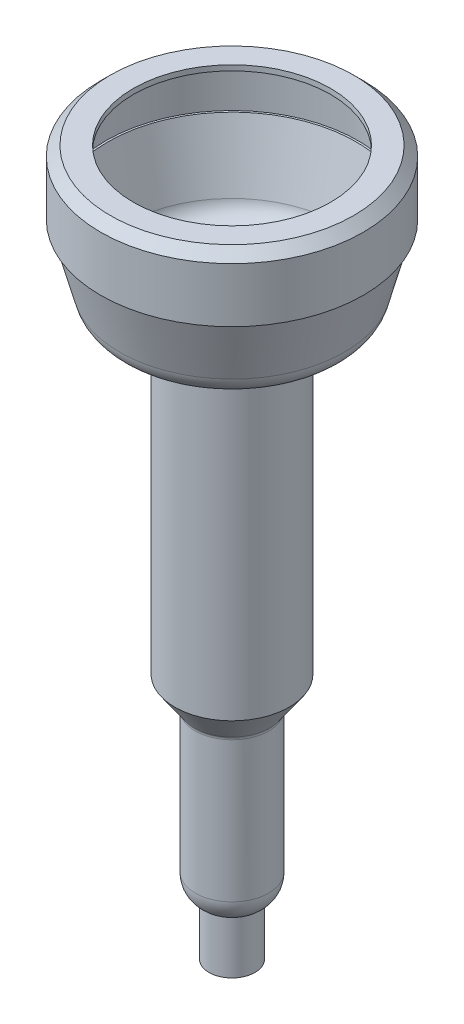
ISO-10303-21;
HEADER;
FILE_DESCRIPTION(('STEP AP214'),'2;1');
FILE_NAME('part.step','',(''),(''),'','','');
FILE_SCHEMA(('AUTOMOTIVE_DESIGN { 1 0 10303 214 1 1 1 1 }'));
ENDSEC;
DATA;
#1=APPLICATION_CONTEXT('core data for automotive mechanical design processes');
#2=APPLICATION_PROTOCOL_DEFINITION('international standard','automotive_design',2000,#1);
#3=PRODUCT_CONTEXT('',#1,'mechanical');
#4=PRODUCT('Part','Part','',(#3));
#5=PRODUCT_RELATED_PRODUCT_CATEGORY('part','',(#4));
#6=PRODUCT_DEFINITION_FORMATION('','',#4);
#7=PRODUCT_DEFINITION_CONTEXT('part definition',#1,'design');
#8=PRODUCT_DEFINITION('design','',#6,#7);
#9=PRODUCT_DEFINITION_SHAPE('','',#8);
#10=(LENGTH_UNIT() NAMED_UNIT(*) SI_UNIT(.MILLI.,.METRE.));
#11=(NAMED_UNIT(*) PLANE_ANGLE_UNIT() SI_UNIT($,.RADIAN.));
#12=(NAMED_UNIT(*) SI_UNIT($,.STERADIAN.) SOLID_ANGLE_UNIT());
#13=UNCERTAINTY_MEASURE_WITH_UNIT(LENGTH_MEASURE(1.E-05),#10,'distance_accuracy_value','');
#14=(GEOMETRIC_REPRESENTATION_CONTEXT(3) GLOBAL_UNCERTAINTY_ASSIGNED_CONTEXT((#13)) GLOBAL_UNIT_ASSIGNED_CONTEXT((#10,
#11,#12)) REPRESENTATION_CONTEXT('',''));
#15=CARTESIAN_POINT('',(0.,0.,0.));
#16=DIRECTION('',(0.,0.,1.));
#17=DIRECTION('',(1.,0.,0.));
#18=AXIS2_PLACEMENT_3D('',#15,#16,#17);
#19=CARTESIAN_POINT('',(0.,14.5,0.));
#20=DIRECTION('',(0.,1.,0.));
#21=DIRECTION('',(-1.,0.,0.));
#22=AXIS2_PLACEMENT_3D('',#19,#20,#21);
#23=CYLINDRICAL_SURFACE('',#22,1.4);
#24=CARTESIAN_POINT('',(0.,-9.21014938269311,0.));
#25=DIRECTION('',(0.,-1.,0.));
#26=DIRECTION('',(1.,0.,0.));
#27=AXIS2_PLACEMENT_3D('',#24,#25,#26);
#28=CIRCLE('',#27,1.4);
#29=CARTESIAN_POINT('',(1.4,-9.21014938269311,0.));
#30=VERTEX_POINT('',#29);
#31=EDGE_CURVE('E11',#30,#30,#28,.F.);
#32=ORIENTED_EDGE('',*,*,#31,.T.);
#33=EDGE_LOOP('',(#32));
#34=FACE_BOUND('',#33,.T.);
#35=CARTESIAN_POINT('',(0.,-3.86569170809116,0.));
#36=DIRECTION('',(0.,1.,0.));
#37=DIRECTION('',(-1.,0.,0.));
#38=AXIS2_PLACEMENT_3D('',#35,#36,#37);
#39=CIRCLE('',#38,1.4);
#40=CARTESIAN_POINT('',(-1.4,-3.86569170809116,0.));
#41=VERTEX_POINT('',#40);
#42=EDGE_CURVE('E82',#41,#41,#39,.T.);
#43=ORIENTED_EDGE('',*,*,#42,.F.);
#44=EDGE_LOOP('',(#43));
#45=FACE_BOUND('',#44,.T.);
#46=ADVANCED_FACE('F38',(#34,#45),#23,.T.);
#47=CARTESIAN_POINT('',(0.,14.5,0.));
#48=DIRECTION('',(0.,1.,0.));
#49=DIRECTION('',(-1.,0.,0.));
#50=AXIS2_PLACEMENT_3D('',#47,#48,#49);
#51=CYLINDRICAL_SURFACE('',#50,3.75577865213881);
#52=CARTESIAN_POINT('',(0.,14.7463628033699,0.));
#53=DIRECTION('',(0.,1.,0.));
#54=DIRECTION('',(-1.,0.,0.));
#55=AXIS2_PLACEMENT_3D('',#52,#53,#54);
#56=CIRCLE('',#55,3.75577865213881);
#57=CARTESIAN_POINT('',(-3.75577865213881,14.7463628033699,0.));
#58=VERTEX_POINT('',#57);
#59=EDGE_CURVE('E49',#58,#58,#56,.T.);
#60=ORIENTED_EDGE('',*,*,#59,.T.);
#61=EDGE_LOOP('',(#60));
#62=FACE_BOUND('',#61,.T.);
#63=CARTESIAN_POINT('',(0.,14.5463628033699,0.));
#64=DIRECTION('',(0.,1.,0.));
#65=DIRECTION('',(-1.,0.,0.));
#66=AXIS2_PLACEMENT_3D('',#63,#64,#65);
#67=CIRCLE('',#66,3.75577865213881);
#68=CARTESIAN_POINT('',(-3.75577865213881,14.5463628033699,0.));
#69=VERTEX_POINT('',#68);
#70=EDGE_CURVE('E109',#69,#69,#67,.T.);
#71=ORIENTED_EDGE('',*,*,#70,.F.);
#72=EDGE_LOOP('',(#71));
#73=FACE_BOUND('',#72,.T.);
#74=ADVANCED_FACE('F134',(#62,#73),#51,.F.);
#75=CARTESIAN_POINT('',(-3.75577865213881,14.7463628033699,0.));
#76=DIRECTION('',(0.,1.,0.));
#77=DIRECTION('',(-1.,0.,0.));
#78=AXIS2_PLACEMENT_3D('',#75,#76,#77);
#79=PLANE('',#78);
#80=CARTESIAN_POINT('',(0.,14.7463628033699,0.));
#81=DIRECTION('',(0.,1.,0.));
#82=DIRECTION('',(-1.,0.,0.));
#83=AXIS2_PLACEMENT_3D('',#80,#81,#82);
#84=CIRCLE('',#83,4.63284271247462);
#85=CARTESIAN_POINT('',(-4.63284271247462,14.7463628033699,0.));
#86=VERTEX_POINT('',#85);
#87=EDGE_CURVE('E53',#86,#86,#84,.T.);
#88=ORIENTED_EDGE('',*,*,#87,.T.);
#89=EDGE_LOOP('',(#88));
#90=FACE_BOUND('',#89,.T.);
#91=ORIENTED_EDGE('',*,*,#59,.F.);
#92=EDGE_LOOP('',(#91));
#93=FACE_BOUND('',#92,.T.);
#94=ADVANCED_FACE('F139',(#90,#93),#79,.T.);
#95=CARTESIAN_POINT('',(0.,14.7463628033699,0.));
#96=DIRECTION('',(0.,-1.,0.));
#97=DIRECTION('',(1.,0.,0.));
#98=AXIS2_PLACEMENT_3D('',#95,#96,#97);
#99=CONICAL_SURFACE('',#98,4.63284271247462,0.785398163397448);
#100=CARTESIAN_POINT('',(0.,14.3792055158445,0.));
#101=DIRECTION('',(0.,1.,0.));
#102=DIRECTION('',(-1.,0.,0.));
#103=AXIS2_PLACEMENT_3D('',#100,#101,#102);
#104=CIRCLE('',#103,5.);
#105=CARTESIAN_POINT('',(-5.,14.3792055158445,0.));
#106=VERTEX_POINT('',#105);
#107=EDGE_CURVE('E58',#106,#106,#104,.T.);
#108=ORIENTED_EDGE('',*,*,#107,.T.);
#109=EDGE_LOOP('',(#108));
#110=FACE_BOUND('',#109,.T.);
#111=ORIENTED_EDGE('',*,*,#87,.F.);
#112=EDGE_LOOP('',(#111));
#113=FACE_BOUND('',#112,.T.);
#114=ADVANCED_FACE('F177',(#110,#113),#99,.T.);
#115=CARTESIAN_POINT('',(0.,14.5,0.));
#116=DIRECTION('',(0.,1.,0.));
#117=DIRECTION('',(-1.,0.,0.));
#118=AXIS2_PLACEMENT_3D('',#115,#116,#117);
#119=CYLINDRICAL_SURFACE('',#118,5.);
#120=CARTESIAN_POINT('',(0.,12.2999976021957,0.));
#121=DIRECTION('',(0.,1.,0.));
#122=DIRECTION('',(-1.,0.,0.));
#123=AXIS2_PLACEMENT_3D('',#120,#121,#122);
#124=CIRCLE('',#123,5.);
#125=CARTESIAN_POINT('',(-5.,12.2999976021957,0.));
#126=VERTEX_POINT('',#125);
#127=EDGE_CURVE('E61',#126,#126,#124,.T.);
#128=ORIENTED_EDGE('',*,*,#127,.T.);
#129=EDGE_LOOP('',(#128));
#130=FACE_BOUND('',#129,.T.);
#131=ORIENTED_EDGE('',*,*,#107,.F.);
#132=EDGE_LOOP('',(#131));
#133=FACE_BOUND('',#132,.T.);
#134=ADVANCED_FACE('F173',(#130,#133),#119,.T.);
#135=CARTESIAN_POINT('',(-5.,12.2999976021957,0.));
#136=DIRECTION('',(0.,-1.,0.));
#137=DIRECTION('',(1.,0.,0.));
#138=AXIS2_PLACEMENT_3D('',#135,#136,#137);
#139=PLANE('',#138);
#140=CARTESIAN_POINT('',(0.,12.2999976021957,0.));
#141=DIRECTION('',(0.,1.,0.));
#142=DIRECTION('',(-1.,0.,0.));
#143=AXIS2_PLACEMENT_3D('',#140,#141,#142);
#144=CIRCLE('',#143,4.87965285359769);
#145=CARTESIAN_POINT('',(-4.87965285359769,12.2999976021957,0.));
#146=VERTEX_POINT('',#145);
#147=EDGE_CURVE('E64',#146,#146,#144,.T.);
#148=ORIENTED_EDGE('',*,*,#147,.T.);
#149=EDGE_LOOP('',(#148));
#150=FACE_BOUND('',#149,.T.);
#151=ORIENTED_EDGE('',*,*,#127,.F.);
#152=EDGE_LOOP('',(#151));
#153=FACE_BOUND('',#152,.T.);
#154=ADVANCED_FACE('F169',(#150,#153),#139,.T.);
#155=CARTESIAN_POINT('',(0.,12.2999976021957,0.));
#156=DIRECTION('',(0.,1.,0.));
#157=DIRECTION('',(-1.,0.,0.));
#158=AXIS2_PLACEMENT_3D('',#155,#156,#157);
#159=CONICAL_SURFACE('',#158,4.87965285359769,0.261799481564779);
#160=CARTESIAN_POINT('',(0.,10.0633353128938,0.));
#161=DIRECTION('',(0.,1.,0.));
#162=DIRECTION('',(-1.,0.,0.));
#163=AXIS2_PLACEMENT_3D('',#160,#161,#162);
#164=CIRCLE('',#163,4.28034077465869);
#165=CARTESIAN_POINT('',(-4.28034077465869,10.0633353128938,0.));
#166=VERTEX_POINT('',#165);
#167=EDGE_CURVE('E67',#166,#166,#164,.T.);
#168=ORIENTED_EDGE('',*,*,#167,.T.);
#169=EDGE_LOOP('',(#168));
#170=FACE_BOUND('',#169,.T.);
#171=ORIENTED_EDGE('',*,*,#147,.F.);
#172=EDGE_LOOP('',(#171));
#173=FACE_BOUND('',#172,.T.);
#174=ADVANCED_FACE('F165',(#170,#173),#159,.T.);
#175=CARTESIAN_POINT('',(0.,10.2395881407188,0.));
#176=DIRECTION('',(0.,1.,0.));
#177=DIRECTION('',(-1.,0.,0.));
#178=AXIS2_PLACEMENT_3D('',#175,#176,#177);
#179=TOROIDAL_SURFACE('',#178,3.34680369167304,0.950029759863165);
#180=CARTESIAN_POINT('',(0.,9.31132349494349,0.));
#181=DIRECTION('',(0.,1.,0.));
#182=DIRECTION('',(-1.,0.,0.));
#183=AXIS2_PLACEMENT_3D('',#180,#181,#182);
#184=CIRCLE('',#183,3.54899491806348);
#185=CARTESIAN_POINT('',(-3.54899491806348,9.31132349494349,0.));
#186=VERTEX_POINT('',#185);
#187=EDGE_CURVE('E70',#186,#186,#184,.T.);
#188=ORIENTED_EDGE('',*,*,#187,.T.);
#189=EDGE_LOOP('',(#188));
#190=FACE_BOUND('',#189,.T.);
#191=ORIENTED_EDGE('',*,*,#167,.F.);
#192=EDGE_LOOP('',(#191));
#193=FACE_BOUND('',#192,.T.);
#194=ADVANCED_FACE('F161',(#190,#193),#179,.T.);
#195=CARTESIAN_POINT('',(-3.54899491806348,9.31132349494349,0.));
#196=DIRECTION('',(0.,-1.,0.));
#197=DIRECTION('',(1.,0.,0.));
#198=AXIS2_PLACEMENT_3D('',#195,#196,#197);
#199=PLANE('',#198);
#200=CARTESIAN_POINT('',(0.,9.31132349494349,0.));
#201=DIRECTION('',(0.,1.,0.));
#202=DIRECTION('',(-1.,0.,0.));
#203=AXIS2_PLACEMENT_3D('',#200,#201,#202);
#204=CIRCLE('',#203,2.18);
#205=CARTESIAN_POINT('',(-2.18,9.31132349494349,0.));
#206=VERTEX_POINT('',#205);
#207=EDGE_CURVE('E73',#206,#206,#204,.T.);
#208=ORIENTED_EDGE('',*,*,#207,.T.);
#209=EDGE_LOOP('',(#208));
#210=FACE_BOUND('',#209,.T.);
#211=ORIENTED_EDGE('',*,*,#187,.F.);
#212=EDGE_LOOP('',(#211));
#213=FACE_BOUND('',#212,.T.);
#214=ADVANCED_FACE('F157',(#210,#213),#199,.T.);
#215=CARTESIAN_POINT('',(0.,14.5,0.));
#216=DIRECTION('',(0.,1.,0.));
#217=DIRECTION('',(-1.,0.,0.));
#218=AXIS2_PLACEMENT_3D('',#215,#216,#217);
#219=CYLINDRICAL_SURFACE('',#218,2.18);
#220=CARTESIAN_POINT('',(0.,-2.68867650505652,0.));
#221=DIRECTION('',(0.,1.,0.));
#222=DIRECTION('',(-1.,0.,0.));
#223=AXIS2_PLACEMENT_3D('',#220,#221,#222);
#224=CIRCLE('',#223,2.18);
#225=CARTESIAN_POINT('',(-2.18,-2.68867650505652,0.));
#226=VERTEX_POINT('',#225);
#227=EDGE_CURVE('E76',#226,#226,#224,.T.);
#228=ORIENTED_EDGE('',*,*,#227,.T.);
#229=EDGE_LOOP('',(#228));
#230=FACE_BOUND('',#229,.T.);
#231=ORIENTED_EDGE('',*,*,#207,.F.);
#232=EDGE_LOOP('',(#231));
#233=FACE_BOUND('',#232,.T.);
#234=ADVANCED_FACE('F153',(#230,#233),#219,.T.);
#235=CARTESIAN_POINT('',(0.,-2.68867650505652,0.));
#236=DIRECTION('',(0.,1.,0.));
#237=DIRECTION('',(-1.,0.,0.));
#238=AXIS2_PLACEMENT_3D('',#235,#236,#237);
#239=CONICAL_SURFACE('',#238,2.18,0.610865238198018);
#240=CARTESIAN_POINT('',(0.,-3.75097642082095,0.));
#241=DIRECTION('',(0.,1.,0.));
#242=DIRECTION('',(-1.,0.,0.));
#243=AXIS2_PLACEMENT_3D('',#240,#241,#242);
#244=CIRCLE('',#243,1.4361695911422);
#245=CARTESIAN_POINT('',(-1.4361695911422,-3.75097642082095,0.));
#246=VERTEX_POINT('',#245);
#247=EDGE_CURVE('E79',#246,#246,#244,.T.);
#248=ORIENTED_EDGE('',*,*,#247,.T.);
#249=EDGE_LOOP('',(#248));
#250=FACE_BOUND('',#249,.T.);
#251=ORIENTED_EDGE('',*,*,#227,.F.);
#252=EDGE_LOOP('',(#251));
#253=FACE_BOUND('',#252,.T.);
#254=ADVANCED_FACE('F149',(#250,#253),#239,.T.);
#255=CARTESIAN_POINT('',(0.,-3.86569170809116,0.));
#256=DIRECTION('',(0.,1.,0.));
#257=DIRECTION('',(-1.,0.,0.));
#258=AXIS2_PLACEMENT_3D('',#255,#256,#257);
#259=TOROIDAL_SURFACE('',#258,1.6,0.2);
#260=ORIENTED_EDGE('',*,*,#42,.T.);
#261=EDGE_LOOP('',(#260));
#262=FACE_BOUND('',#261,.T.);
#263=ORIENTED_EDGE('',*,*,#247,.F.);
#264=EDGE_LOOP('',(#263));
#265=FACE_BOUND('',#264,.T.);
#266=ADVANCED_FACE('F146',(#262,#265),#259,.F.);
#267=CARTESIAN_POINT('',(0.,-3.69422263882273,0.));
#268=DIRECTION('',(0.,1.,0.));
#269=DIRECTION('',(-1.,0.,0.));
#270=AXIS2_PLACEMENT_3D('',#267,#268,#269);
#271=CONICAL_SURFACE('',#270,1.2561695911422,0.610865238198017);
#272=CARTESIAN_POINT('',(0.,-3.48881152710356,0.));
#273=DIRECTION('',(0.,1.,0.));
#274=DIRECTION('',(-1.,0.,0.));
#275=AXIS2_PLACEMENT_3D('',#272,#273,#274);
#276=CIRCLE('',#275,1.4);
#277=CARTESIAN_POINT('',(-1.4,-3.48881152710356,0.));
#278=VERTEX_POINT('',#277);
#279=EDGE_CURVE('E45',#278,#278,#276,.T.);
#280=ORIENTED_EDGE('',*,*,#279,.F.);
#281=EDGE_LOOP('',(#280));
#282=FACE_BOUND('',#281,.T.);
#283=CARTESIAN_POINT('',(0.,-2.6319227230583,0.));
#284=DIRECTION('',(0.,1.,0.));
#285=DIRECTION('',(-1.,0.,0.));
#286=AXIS2_PLACEMENT_3D('',#283,#284,#285);
#287=CIRCLE('',#286,2.);
#288=CARTESIAN_POINT('',(-2.,-2.6319227230583,0.));
#289=VERTEX_POINT('',#288);
#290=EDGE_CURVE('E85',#289,#289,#287,.T.);
#291=ORIENTED_EDGE('',*,*,#290,.T.);
#292=EDGE_LOOP('',(#291));
#293=FACE_BOUND('',#292,.T.);
#294=ADVANCED_FACE('F144',(#282,#293),#271,.F.);
#295=CARTESIAN_POINT('',(0.,14.5,0.));
#296=DIRECTION('',(0.,1.,0.));
#297=DIRECTION('',(-1.,0.,0.));
#298=AXIS2_PLACEMENT_3D('',#295,#296,#297);
#299=CYLINDRICAL_SURFACE('',#298,2.);
#300=CARTESIAN_POINT('',(0.,9.48956158171761,0.));
#301=DIRECTION('',(0.,1.,0.));
#302=DIRECTION('',(-1.,0.,0.));
#303=AXIS2_PLACEMENT_3D('',#300,#301,#302);
#304=CIRCLE('',#303,2.);
#305=CARTESIAN_POINT('',(-2.,9.48956158171761,0.));
#306=VERTEX_POINT('',#305);
#307=EDGE_CURVE('E88',#306,#306,#304,.T.);
#308=ORIENTED_EDGE('',*,*,#307,.T.);
#309=EDGE_LOOP('',(#308));
#310=FACE_BOUND('',#309,.T.);
#311=ORIENTED_EDGE('',*,*,#290,.F.);
#312=EDGE_LOOP('',(#311));
#313=FACE_BOUND('',#312,.T.);
#314=ADVANCED_FACE('F232',(#310,#313),#299,.F.);
#315=CARTESIAN_POINT('',(-3.34899491808895,9.48956158171761,0.));
#316=DIRECTION('',(0.,1.,0.));
#317=DIRECTION('',(-1.,0.,0.));
#318=AXIS2_PLACEMENT_3D('',#315,#316,#317);
#319=PLANE('',#318);
#320=CARTESIAN_POINT('',(0.,9.4895615817176,0.));
#321=DIRECTION('',(0.,1.,0.));
#322=DIRECTION('',(-1.,0.,0.));
#323=AXIS2_PLACEMENT_3D('',#320,#321,#322);
#324=CIRCLE('',#323,3.34899491808895);
#325=CARTESIAN_POINT('',(-3.34899491808895,9.4895615817176,0.));
#326=VERTEX_POINT('',#325);
#327=EDGE_CURVE('E91',#326,#326,#324,.T.);
#328=ORIENTED_EDGE('',*,*,#327,.T.);
#329=EDGE_LOOP('',(#328));
#330=FACE_BOUND('',#329,.T.);
#331=ORIENTED_EDGE('',*,*,#307,.F.);
#332=EDGE_LOOP('',(#331));
#333=FACE_BOUND('',#332,.T.);
#334=ADVANCED_FACE('F226',(#330,#333),#319,.T.);
#335=CARTESIAN_POINT('',(0.,10.2395881407188,0.));
#336=DIRECTION('',(0.,1.,0.));
#337=DIRECTION('',(-1.,0.,0.));
#338=AXIS2_PLACEMENT_3D('',#335,#336,#337);
#339=TOROIDAL_SURFACE('',#338,3.34680369167304,0.750029759863166);
#340=CARTESIAN_POINT('',(0.,10.1074028345603,0.));
#341=DIRECTION('',(0.,1.,0.));
#342=DIRECTION('',(-1.,0.,0.));
#343=AXIS2_PLACEMENT_3D('',#340,#341,#342);
#344=CIRCLE('',#343,4.08509339464619);
#345=CARTESIAN_POINT('',(-4.08509339464619,10.1074028345603,0.));
#346=VERTEX_POINT('',#345);
#347=EDGE_CURVE('E94',#346,#346,#344,.T.);
#348=ORIENTED_EDGE('',*,*,#347,.T.);
#349=EDGE_LOOP('',(#348));
#350=FACE_BOUND('',#349,.T.);
#351=ORIENTED_EDGE('',*,*,#327,.F.);
#352=EDGE_LOOP('',(#351));
#353=FACE_BOUND('',#352,.T.);
#354=ADVANCED_FACE('F220',(#350,#353),#339,.F.);
#355=CARTESIAN_POINT('',(0.,10.1074028345603,0.));
#356=DIRECTION('',(0.,1.,0.));
#357=DIRECTION('',(-1.,0.,0.));
#358=AXIS2_PLACEMENT_3D('',#355,#356,#357);
#359=CONICAL_SURFACE('',#358,4.08509339464619,0.261799481564785);
#360=CARTESIAN_POINT('',(0.,12.4999976021957,0.));
#361=DIRECTION('',(0.,1.,0.));
#362=DIRECTION('',(-1.,0.,0.));
#363=AXIS2_PLACEMENT_3D('',#360,#361,#362);
#364=CIRCLE('',#363,4.7261874708993);
#365=CARTESIAN_POINT('',(-4.7261874708993,12.4999976021957,0.));
#366=VERTEX_POINT('',#365);
#367=EDGE_CURVE('E97',#366,#366,#364,.T.);
#368=ORIENTED_EDGE('',*,*,#367,.T.);
#369=EDGE_LOOP('',(#368));
#370=FACE_BOUND('',#369,.T.);
#371=ORIENTED_EDGE('',*,*,#347,.F.);
#372=EDGE_LOOP('',(#371));
#373=FACE_BOUND('',#372,.T.);
#374=ADVANCED_FACE('F214',(#370,#373),#359,.F.);
#375=CARTESIAN_POINT('',(-4.8,12.4999976021957,0.));
#376=DIRECTION('',(0.,1.,0.));
#377=DIRECTION('',(-1.,0.,0.));
#378=AXIS2_PLACEMENT_3D('',#375,#376,#377);
#379=PLANE('',#378);
#380=CARTESIAN_POINT('',(0.,12.4999976021957,0.));
#381=DIRECTION('',(0.,1.,0.));
#382=DIRECTION('',(-1.,0.,0.));
#383=AXIS2_PLACEMENT_3D('',#380,#381,#382);
#384=CIRCLE('',#383,4.8);
#385=CARTESIAN_POINT('',(-4.8,12.4999976021957,0.));
#386=VERTEX_POINT('',#385);
#387=EDGE_CURVE('E100',#386,#386,#384,.T.);
#388=ORIENTED_EDGE('',*,*,#387,.T.);
#389=EDGE_LOOP('',(#388));
#390=FACE_BOUND('',#389,.T.);
#391=ORIENTED_EDGE('',*,*,#367,.F.);
#392=EDGE_LOOP('',(#391));
#393=FACE_BOUND('',#392,.T.);
#394=ADVANCED_FACE('F208',(#390,#393),#379,.T.);
#395=CARTESIAN_POINT('',(0.,14.5,0.));
#396=DIRECTION('',(0.,1.,0.));
#397=DIRECTION('',(-1.,0.,0.));
#398=AXIS2_PLACEMENT_3D('',#395,#396,#397);
#399=CYLINDRICAL_SURFACE('',#398,4.8);
#400=CARTESIAN_POINT('',(0.,14.2963628033699,0.));
#401=DIRECTION('',(0.,1.,0.));
#402=DIRECTION('',(-1.,0.,0.));
#403=AXIS2_PLACEMENT_3D('',#400,#401,#402);
#404=CIRCLE('',#403,4.8);
#405=CARTESIAN_POINT('',(-4.8,14.2963628033699,0.));
#406=VERTEX_POINT('',#405);
#407=EDGE_CURVE('E103',#406,#406,#404,.T.);
#408=ORIENTED_EDGE('',*,*,#407,.T.);
#409=EDGE_LOOP('',(#408));
#410=FACE_BOUND('',#409,.T.);
#411=ORIENTED_EDGE('',*,*,#387,.F.);
#412=EDGE_LOOP('',(#411));
#413=FACE_BOUND('',#412,.T.);
#414=ADVANCED_FACE('F202',(#410,#413),#399,.F.);
#415=CARTESIAN_POINT('',(0.,14.2963628033699,0.));
#416=DIRECTION('',(0.,-1.,0.));
#417=DIRECTION('',(1.,0.,0.));
#418=AXIS2_PLACEMENT_3D('',#415,#416,#417);
#419=CONICAL_SURFACE('',#418,4.8,0.78539816339745);
#420=CARTESIAN_POINT('',(0.,14.5463628033699,0.));
#421=DIRECTION('',(0.,1.,0.));
#422=DIRECTION('',(-1.,0.,0.));
#423=AXIS2_PLACEMENT_3D('',#420,#421,#422);
#424=CIRCLE('',#423,4.55);
#425=CARTESIAN_POINT('',(-4.55,14.5463628033699,0.));
#426=VERTEX_POINT('',#425);
#427=EDGE_CURVE('E106',#426,#426,#424,.T.);
#428=ORIENTED_EDGE('',*,*,#427,.T.);
#429=EDGE_LOOP('',(#428));
#430=FACE_BOUND('',#429,.T.);
#431=ORIENTED_EDGE('',*,*,#407,.F.);
#432=EDGE_LOOP('',(#431));
#433=FACE_BOUND('',#432,.T.);
#434=ADVANCED_FACE('F196',(#430,#433),#419,.F.);
#435=CARTESIAN_POINT('',(-3.75577865213881,14.5463628033699,0.));
#436=DIRECTION('',(0.,-1.,0.));
#437=DIRECTION('',(1.,0.,0.));
#438=AXIS2_PLACEMENT_3D('',#435,#436,#437);
#439=PLANE('',#438);
#440=ORIENTED_EDGE('',*,*,#70,.T.);
#441=EDGE_LOOP('',(#440));
#442=FACE_BOUND('',#441,.T.);
#443=ORIENTED_EDGE('',*,*,#427,.F.);
#444=EDGE_LOOP('',(#443));
#445=FACE_BOUND('',#444,.T.);
#446=ADVANCED_FACE('F192',(#442,#445),#439,.T.);
#447=CARTESIAN_POINT('',(0.,-0.0901351780330092,0.));
#448=DIRECTION('',(0.,-1.,0.));
#449=DIRECTION('',(1.,0.,0.));
#450=AXIS2_PLACEMENT_3D('',#447,#448,#449);
#451=PLANE('',#450);
#452=CARTESIAN_POINT('',(0.,-0.0901351780330092,0.));
#453=DIRECTION('',(0.,-1.,0.));
#454=DIRECTION('',(1.,0.,0.));
#455=AXIS2_PLACEMENT_3D('',#452,#453,#454);
#456=CIRCLE('',#455,1.4);
#457=CARTESIAN_POINT('',(1.4,-0.090135178033009,0.));
#458=VERTEX_POINT('',#457);
#459=EDGE_CURVE('E112',#458,#458,#456,.T.);
#460=ORIENTED_EDGE('',*,*,#459,.F.);
#461=EDGE_LOOP('',(#460));
#462=FACE_BOUND('',#461,.T.);
#463=ADVANCED_FACE('F195',(#462),#451,.F.);
#464=CARTESIAN_POINT('',(0.,-0.0901351780330092,0.));
#465=DIRECTION('',(0.,-1.,0.));
#466=DIRECTION('',(1.,0.,0.));
#467=AXIS2_PLACEMENT_3D('',#464,#465,#466);
#468=CYLINDRICAL_SURFACE('',#467,1.4);
#469=ORIENTED_EDGE('',*,*,#279,.T.);
#470=EDGE_LOOP('',(#469));
#471=FACE_BOUND('',#470,.T.);
#472=ORIENTED_EDGE('',*,*,#459,.T.);
#473=EDGE_LOOP('',(#472));
#474=FACE_BOUND('',#473,.T.);
#475=ADVANCED_FACE('F254',(#471,#474),#468,.T.);
#476=CARTESIAN_POINT('',(0.,-10.090135178033,0.));
#477=DIRECTION('',(0.,-1.,0.));
#478=DIRECTION('',(1.,0.,0.));
#479=AXIS2_PLACEMENT_3D('',#476,#477,#478);
#480=CYLINDRICAL_SURFACE('',#479,0.875);
#481=CARTESIAN_POINT('',(0.,-10.090135178033,0.));
#482=DIRECTION('',(0.,-1.,0.));
#483=DIRECTION('',(1.,0.,0.));
#484=AXIS2_PLACEMENT_3D('',#481,#482,#483);
#485=CIRCLE('',#484,0.875);
#486=CARTESIAN_POINT('',(0.875000000000003,-10.090135178033,0.));
#487=VERTEX_POINT('',#486);
#488=EDGE_CURVE('E115',#487,#487,#485,.T.);
#489=ORIENTED_EDGE('',*,*,#488,.T.);
#490=EDGE_LOOP('',(#489));
#491=FACE_BOUND('',#490,.T.);
#492=CARTESIAN_POINT('',(0.,-12.090135178033,0.));
#493=DIRECTION('',(0.,-1.,0.));
#494=DIRECTION('',(1.,0.,0.));
#495=AXIS2_PLACEMENT_3D('',#492,#493,#494);
#496=CIRCLE('',#495,0.875);
#497=CARTESIAN_POINT('',(0.875000000000003,-12.090135178033,0.));
#498=VERTEX_POINT('',#497);
#499=EDGE_CURVE('E116',#498,#498,#496,.T.);
#500=ORIENTED_EDGE('',*,*,#499,.F.);
#501=EDGE_LOOP('',(#500));
#502=FACE_BOUND('',#501,.T.);
#503=ADVANCED_FACE('F122',(#491,#502),#480,.T.);
#504=CARTESIAN_POINT('',(0.,-12.090135178033,0.));
#505=DIRECTION('',(0.,-1.,0.));
#506=DIRECTION('',(1.,0.,0.));
#507=AXIS2_PLACEMENT_3D('',#504,#505,#506);
#508=PLANE('',#507);
#509=ORIENTED_EDGE('',*,*,#499,.T.);
#510=EDGE_LOOP('',(#509));
#511=FACE_BOUND('',#510,.T.);
#512=ADVANCED_FACE('F127',(#511),#508,.T.);
#513=CARTESIAN_POINT('',(0.,-9.21014938269311,0.));
#514=DIRECTION('',(0.,-1.,0.));
#515=DIRECTION('',(1.,0.,0.));
#516=AXIS2_PLACEMENT_3D('',#513,#514,#515);
#517=DEGENERATE_TOROIDAL_SURFACE('',#516,0.4,1.,.T.);
#518=ORIENTED_EDGE('',*,*,#488,.F.);
#519=EDGE_LOOP('',(#518));
#520=FACE_BOUND('',#519,.T.);
#521=ORIENTED_EDGE('',*,*,#31,.F.);
#522=EDGE_LOOP('',(#521));
#523=FACE_BOUND('',#522,.T.);
#524=ADVANCED_FACE('F40',(#520,#523),#517,.T.);
#525=CLOSED_SHELL('',(#46,#74,#94,#114,#134,#154,#174,#194,#214,#234,#254,#266,#294,#314,#334,
#354,#374,#394,#414,#434,#446,#463,#475,#503,#512,#524));
#526=MANIFOLD_SOLID_BREP('B2',#525);
#527=ADVANCED_BREP_SHAPE_REPRESENTATION('',(#18,#526),#14);
#528=SHAPE_DEFINITION_REPRESENTATION(#9,#527);
ENDSEC;
END-ISO-10303-21;
